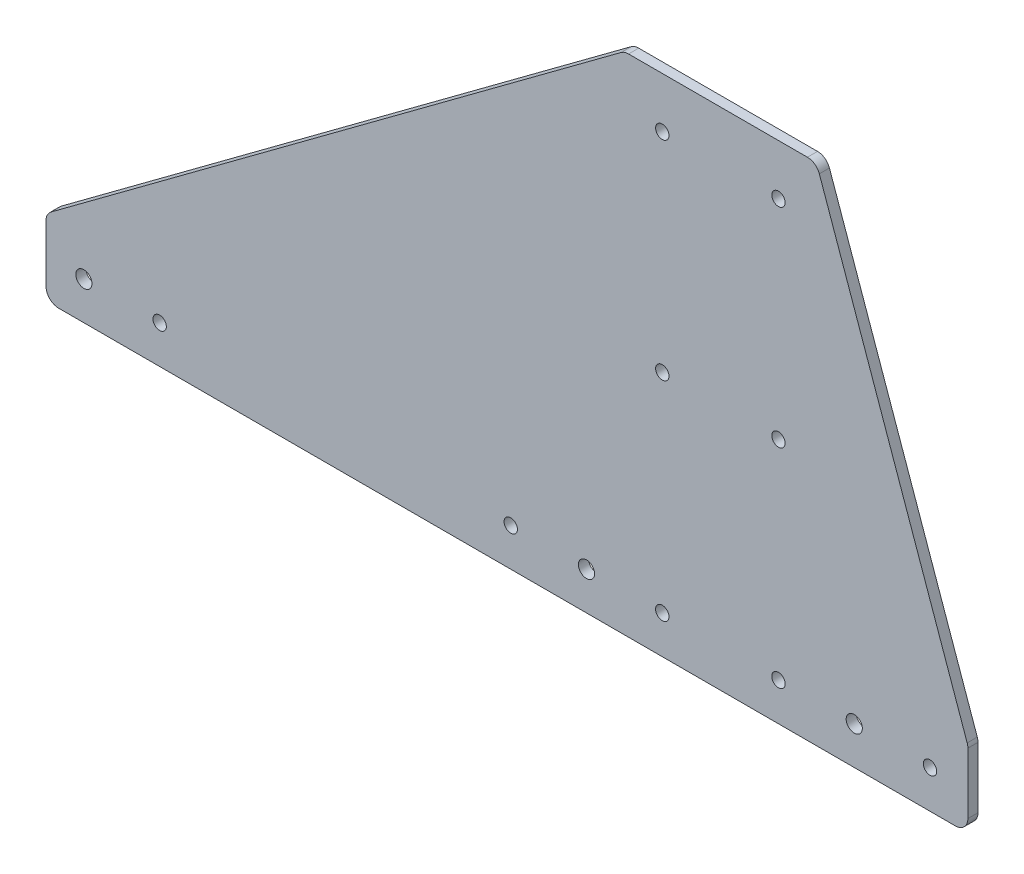
ISO-10303-21;
HEADER;
FILE_DESCRIPTION(('STEP AP214'),'2;1');
FILE_NAME('part.step','',(''),(''),'','','');
FILE_SCHEMA(('AUTOMOTIVE_DESIGN { 1 0 10303 214 1 1 1 1 }'));
ENDSEC;
DATA;
#1=APPLICATION_CONTEXT('core data for automotive mechanical design processes');
#2=APPLICATION_PROTOCOL_DEFINITION('international standard','automotive_design',2000,#1);
#3=PRODUCT_CONTEXT('',#1,'mechanical');
#4=PRODUCT('Part','Part','',(#3));
#5=PRODUCT_RELATED_PRODUCT_CATEGORY('part','',(#4));
#6=PRODUCT_DEFINITION_FORMATION('','',#4);
#7=PRODUCT_DEFINITION_CONTEXT('part definition',#1,'design');
#8=PRODUCT_DEFINITION('design','',#6,#7);
#9=PRODUCT_DEFINITION_SHAPE('','',#8);
#10=(LENGTH_UNIT() NAMED_UNIT(*) SI_UNIT(.MILLI.,.METRE.));
#11=(NAMED_UNIT(*) PLANE_ANGLE_UNIT() SI_UNIT($,.RADIAN.));
#12=(NAMED_UNIT(*) SI_UNIT($,.STERADIAN.) SOLID_ANGLE_UNIT());
#13=UNCERTAINTY_MEASURE_WITH_UNIT(LENGTH_MEASURE(1.E-05),#10,'distance_accuracy_value','');
#14=(GEOMETRIC_REPRESENTATION_CONTEXT(3) GLOBAL_UNCERTAINTY_ASSIGNED_CONTEXT((#13)) GLOBAL_UNIT_ASSIGNED_CONTEXT((#10,
#11,#12)) REPRESENTATION_CONTEXT('',''));
#15=CARTESIAN_POINT('',(0.,0.,0.));
#16=DIRECTION('',(0.,0.,1.));
#17=DIRECTION('',(1.,0.,0.));
#18=AXIS2_PLACEMENT_3D('',#15,#16,#17);
#19=CARTESIAN_POINT('',(-267.,0.,4.));
#20=DIRECTION('',(1.,0.,0.));
#21=DIRECTION('',(0.,0.,-1.));
#22=AXIS2_PLACEMENT_3D('',#19,#20,#21);
#23=PLANE('',#22);
#24=DIRECTION('',(0.,-1.,0.));
#25=VECTOR('',#24,1.);
#26=CARTESIAN_POINT('',(-267.,0.,0.));
#27=LINE('',#26,#25);
#28=CARTESIAN_POINT('',(-267.,-2.51535886821908,0.));
#29=VERTEX_POINT('',#28);
#30=CARTESIAN_POINT('',(-267.,-25.,0.));
#31=VERTEX_POINT('',#30);
#32=EDGE_CURVE('E202',#29,#31,#27,.T.);
#33=ORIENTED_EDGE('',*,*,#32,.T.);
#34=DIRECTION('',(0.,0.,-1.));
#35=VECTOR('',#34,1.);
#36=CARTESIAN_POINT('',(-267.,-25.,4.));
#37=LINE('',#36,#35);
#38=CARTESIAN_POINT('',(-267.,-25.,4.));
#39=VERTEX_POINT('',#38);
#40=EDGE_CURVE('E194',#31,#39,#37,.F.);
#41=ORIENTED_EDGE('',*,*,#40,.T.);
#42=DIRECTION('',(0.,-1.,0.));
#43=VECTOR('',#42,1.);
#44=CARTESIAN_POINT('',(-267.,0.,4.));
#45=LINE('',#44,#43);
#46=CARTESIAN_POINT('',(-267.,-2.51535886821908,4.));
#47=VERTEX_POINT('',#46);
#48=EDGE_CURVE('E151',#47,#39,#45,.T.);
#49=ORIENTED_EDGE('',*,*,#48,.F.);
#50=DIRECTION('',(0.,0.,-1.));
#51=VECTOR('',#50,1.);
#52=CARTESIAN_POINT('',(-267.,-2.51535886821908,4.));
#53=LINE('',#52,#51);
#54=EDGE_CURVE('E191',#47,#29,#53,.T.);
#55=ORIENTED_EDGE('',*,*,#54,.T.);
#56=EDGE_LOOP('',(#33,#41,#49,#55));
#57=FACE_BOUND('',#56,.T.);
#58=ADVANCED_FACE('F33',(#57),#23,.F.);
#59=CARTESIAN_POINT('',(-267.,-30.,4.));
#60=DIRECTION('',(0.,1.,0.));
#61=DIRECTION('',(0.,0.,1.));
#62=AXIS2_PLACEMENT_3D('',#59,#60,#61);
#63=PLANE('',#62);
#64=DIRECTION('',(1.,0.,0.));
#65=VECTOR('',#64,1.);
#66=CARTESIAN_POINT('',(-267.,-30.,0.));
#67=LINE('',#66,#65);
#68=CARTESIAN_POINT('',(-262.,-30.,0.));
#69=VERTEX_POINT('',#68);
#70=CARTESIAN_POINT('',(92.9999999999999,-30.,0.));
#71=VERTEX_POINT('',#70);
#72=EDGE_CURVE('E229',#69,#71,#67,.T.);
#73=ORIENTED_EDGE('',*,*,#72,.T.);
#74=DIRECTION('',(0.,0.,-1.));
#75=VECTOR('',#74,1.);
#76=CARTESIAN_POINT('',(93.,-30.,4.));
#77=LINE('',#76,#75);
#78=CARTESIAN_POINT('',(92.9999999999999,-30.,4.));
#79=VERTEX_POINT('',#78);
#80=EDGE_CURVE('E189',#71,#79,#77,.F.);
#81=ORIENTED_EDGE('',*,*,#80,.T.);
#82=DIRECTION('',(1.,0.,0.));
#83=VECTOR('',#82,1.);
#84=CARTESIAN_POINT('',(-267.,-30.,4.));
#85=LINE('',#84,#83);
#86=CARTESIAN_POINT('',(-262.,-30.,4.));
#87=VERTEX_POINT('',#86);
#88=EDGE_CURVE('E212',#87,#79,#85,.T.);
#89=ORIENTED_EDGE('',*,*,#88,.F.);
#90=DIRECTION('',(0.,0.,-1.));
#91=VECTOR('',#90,1.);
#92=CARTESIAN_POINT('',(-262.,-30.,4.));
#93=LINE('',#92,#91);
#94=EDGE_CURVE('E186',#87,#69,#93,.T.);
#95=ORIENTED_EDGE('',*,*,#94,.T.);
#96=EDGE_LOOP('',(#73,#81,#89,#95));
#97=FACE_BOUND('',#96,.T.);
#98=ADVANCED_FACE('F253',(#97),#63,.F.);
#99=CARTESIAN_POINT('',(98.,-30.,4.));
#100=DIRECTION('',(-1.,0.,0.));
#101=DIRECTION('',(0.,0.,1.));
#102=AXIS2_PLACEMENT_3D('',#99,#100,#101);
#103=PLANE('',#102);
#104=DIRECTION('',(0.,1.,0.));
#105=VECTOR('',#104,1.);
#106=CARTESIAN_POINT('',(98.,-30.,0.));
#107=LINE('',#106,#105);
#108=CARTESIAN_POINT('',(98.,-25.,0.));
#109=VERTEX_POINT('',#108);
#110=CARTESIAN_POINT('',(98.,-0.856463647766592,0.));
#111=VERTEX_POINT('',#110);
#112=EDGE_CURVE('E153',#109,#111,#107,.T.);
#113=ORIENTED_EDGE('',*,*,#112,.T.);
#114=DIRECTION('',(0.,0.,-1.));
#115=VECTOR('',#114,1.);
#116=CARTESIAN_POINT('',(98.,-0.856463647766592,4.));
#117=LINE('',#116,#115);
#118=CARTESIAN_POINT('',(98.,-0.856463647766592,4.));
#119=VERTEX_POINT('',#118);
#120=EDGE_CURVE('E184',#111,#119,#117,.F.);
#121=ORIENTED_EDGE('',*,*,#120,.T.);
#122=DIRECTION('',(0.,1.,0.));
#123=VECTOR('',#122,1.);
#124=CARTESIAN_POINT('',(98.,-30.,4.));
#125=LINE('',#124,#123);
#126=CARTESIAN_POINT('',(98.,-25.,4.));
#127=VERTEX_POINT('',#126);
#128=EDGE_CURVE('E215',#127,#119,#125,.T.);
#129=ORIENTED_EDGE('',*,*,#128,.F.);
#130=DIRECTION('',(0.,0.,-1.));
#131=VECTOR('',#130,1.);
#132=CARTESIAN_POINT('',(98.,-25.,4.));
#133=LINE('',#132,#131);
#134=EDGE_CURVE('E181',#127,#109,#133,.T.);
#135=ORIENTED_EDGE('',*,*,#134,.T.);
#136=EDGE_LOOP('',(#113,#121,#129,#135));
#137=FACE_BOUND('',#136,.T.);
#138=ADVANCED_FACE('F235',(#137),#103,.F.);
#139=CARTESIAN_POINT('',(98.,0.,4.));
#140=DIRECTION('',(-0.94299033358289,-0.332820117735137,0.));
#141=DIRECTION('',(0.332820117735137,-0.94299033358289,0.));
#142=AXIS2_PLACEMENT_3D('',#139,#140,#141);
#143=PLANE('',#142);
#144=DIRECTION('',(-0.332820117735137,0.94299033358289,0.));
#145=VECTOR('',#144,1.);
#146=CARTESIAN_POINT('',(98.,0.,0.));
#147=LINE('',#146,#145);
#148=CARTESIAN_POINT('',(97.7149516679144,0.807636940909095,0.));
#149=VERTEX_POINT('',#148);
#150=CARTESIAN_POINT('',(39.1773762628204,166.664100588676,0.));
#151=VERTEX_POINT('',#150);
#152=EDGE_CURVE('E149',#149,#151,#147,.T.);
#153=ORIENTED_EDGE('',*,*,#152,.T.);
#154=DIRECTION('',(0.,0.,-1.));
#155=VECTOR('',#154,1.);
#156=CARTESIAN_POINT('',(39.1773762628203,166.664100588676,4.));
#157=LINE('',#156,#155);
#158=CARTESIAN_POINT('',(39.1773762628204,166.664100588676,4.));
#159=VERTEX_POINT('',#158);
#160=EDGE_CURVE('E128',#151,#159,#157,.F.);
#161=ORIENTED_EDGE('',*,*,#160,.T.);
#162=DIRECTION('',(-0.332820117735137,0.94299033358289,0.));
#163=VECTOR('',#162,1.);
#164=CARTESIAN_POINT('',(98.,0.,4.));
#165=LINE('',#164,#163);
#166=CARTESIAN_POINT('',(97.7149516679144,0.807636940909095,4.));
#167=VERTEX_POINT('',#166);
#168=EDGE_CURVE('E223',#167,#159,#165,.T.);
#169=ORIENTED_EDGE('',*,*,#168,.F.);
#170=DIRECTION('',(0.,0.,-1.));
#171=VECTOR('',#170,1.);
#172=CARTESIAN_POINT('',(97.7149516679144,0.807636940909095,4.));
#173=LINE('',#172,#171);
#174=EDGE_CURVE('E133',#167,#149,#173,.T.);
#175=ORIENTED_EDGE('',*,*,#174,.T.);
#176=EDGE_LOOP('',(#153,#161,#169,#175));
#177=FACE_BOUND('',#176,.T.);
#178=ADVANCED_FACE('F245',(#177),#143,.F.);
#179=CARTESIAN_POINT('',(38.,170.,4.));
#180=DIRECTION('',(0.,-1.,0.));
#181=DIRECTION('',(0.,0.,-1.));
#182=AXIS2_PLACEMENT_3D('',#179,#180,#181);
#183=PLANE('',#182);
#184=DIRECTION('',(-1.,0.,0.));
#185=VECTOR('',#184,1.);
#186=CARTESIAN_POINT('',(38.,170.,4.));
#187=LINE('',#186,#185);
#188=CARTESIAN_POINT('',(34.4624245949059,170.,4.));
#189=VERTEX_POINT('',#188);
#190=CARTESIAN_POINT('',(-36.3469577598696,170.,4.));
#191=VERTEX_POINT('',#190);
#192=EDGE_CURVE('E142',#189,#191,#187,.T.);
#193=ORIENTED_EDGE('',*,*,#192,.F.);
#194=DIRECTION('',(0.,0.,-1.));
#195=VECTOR('',#194,1.);
#196=CARTESIAN_POINT('',(34.4624245949059,170.,4.));
#197=LINE('',#196,#195);
#198=CARTESIAN_POINT('',(34.4624245949059,170.,0.));
#199=VERTEX_POINT('',#198);
#200=EDGE_CURVE('E127',#189,#199,#197,.T.);
#201=ORIENTED_EDGE('',*,*,#200,.T.);
#202=DIRECTION('',(-1.,0.,0.));
#203=VECTOR('',#202,1.);
#204=CARTESIAN_POINT('',(38.,170.,0.));
#205=LINE('',#204,#203);
#206=CARTESIAN_POINT('',(-36.3469577598696,170.,0.));
#207=VERTEX_POINT('',#206);
#208=EDGE_CURVE('E140',#199,#207,#205,.T.);
#209=ORIENTED_EDGE('',*,*,#208,.T.);
#210=DIRECTION('',(0.,0.,-1.));
#211=VECTOR('',#210,1.);
#212=CARTESIAN_POINT('',(-36.3469577598696,170.,4.));
#213=LINE('',#212,#211);
#214=EDGE_CURVE('E144',#207,#191,#213,.F.);
#215=ORIENTED_EDGE('',*,*,#214,.T.);
#216=EDGE_LOOP('',(#193,#201,#209,#215));
#217=FACE_BOUND('',#216,.T.);
#218=ADVANCED_FACE('F139',(#217),#183,.F.);
#219=CARTESIAN_POINT('',(-38.,170.,4.));
#220=DIRECTION('',(0.596065749719744,-0.802935627563655,0.));
#221=DIRECTION('',(0.802935627563655,0.596065749719744,0.));
#222=AXIS2_PLACEMENT_3D('',#219,#220,#221);
#223=PLANE('',#222);
#224=DIRECTION('',(-0.802935627563655,-0.596065749719744,0.));
#225=VECTOR('',#224,1.);
#226=CARTESIAN_POINT('',(-38.,170.,0.));
#227=LINE('',#226,#225);
#228=CARTESIAN_POINT('',(-39.3272865084683,169.014678137818,0.));
#229=VERTEX_POINT('',#228);
#230=CARTESIAN_POINT('',(-264.980328748599,1.49931926959923,0.));
#231=VERTEX_POINT('',#230);
#232=EDGE_CURVE('E148',#229,#231,#227,.T.);
#233=ORIENTED_EDGE('',*,*,#232,.T.);
#234=DIRECTION('',(0.,0.,-1.));
#235=VECTOR('',#234,1.);
#236=CARTESIAN_POINT('',(-264.980328748599,1.4993192695992,4.));
#237=LINE('',#236,#235);
#238=CARTESIAN_POINT('',(-264.980328748599,1.49931926959923,4.));
#239=VERTEX_POINT('',#238);
#240=EDGE_CURVE('E11',#231,#239,#237,.F.);
#241=ORIENTED_EDGE('',*,*,#240,.T.);
#242=DIRECTION('',(-0.802935627563655,-0.596065749719744,0.));
#243=VECTOR('',#242,1.);
#244=CARTESIAN_POINT('',(-38.,170.,4.));
#245=LINE('',#244,#243);
#246=CARTESIAN_POINT('',(-39.3272865084683,169.014678137818,4.));
#247=VERTEX_POINT('',#246);
#248=EDGE_CURVE('E157',#247,#239,#245,.T.);
#249=ORIENTED_EDGE('',*,*,#248,.F.);
#250=DIRECTION('',(0.,0.,-1.));
#251=VECTOR('',#250,1.);
#252=CARTESIAN_POINT('',(-39.3272865084683,169.014678137818,4.));
#253=LINE('',#252,#251);
#254=EDGE_CURVE('E42',#247,#229,#253,.T.);
#255=ORIENTED_EDGE('',*,*,#254,.T.);
#256=EDGE_LOOP('',(#233,#241,#249,#255));
#257=FACE_BOUND('',#256,.T.);
#258=ADVANCED_FACE('F198',(#257),#223,.F.);
#259=CARTESIAN_POINT('',(0.,0.,4.));
#260=DIRECTION('',(0.,0.,1.));
#261=DIRECTION('',(1.,0.,0.));
#262=AXIS2_PLACEMENT_3D('',#259,#260,#261);
#263=PLANE('',#262);
#264=CARTESIAN_POINT('',(-252.,-15.0000000000002,4.));
#265=DIRECTION('',(0.,0.,1.));
#266=DIRECTION('',(1.,0.,0.));
#267=AXIS2_PLACEMENT_3D('',#264,#265,#266);
#268=CIRCLE('',#267,3.20000000000001);
#269=CARTESIAN_POINT('',(-248.8,-15.0000000000002,4.));
#270=VERTEX_POINT('',#269);
#271=EDGE_CURVE('E435',#270,#270,#268,.T.);
#272=ORIENTED_EDGE('',*,*,#271,.F.);
#273=EDGE_LOOP('',(#272));
#274=FACE_BOUND('',#273,.T.);
#275=CARTESIAN_POINT('',(-53.,-15.0000000000003,4.));
#276=DIRECTION('',(0.,0.,1.));
#277=DIRECTION('',(1.,0.,0.));
#278=AXIS2_PLACEMENT_3D('',#275,#276,#277);
#279=CIRCLE('',#278,3.2);
#280=CARTESIAN_POINT('',(-49.8,-15.0000000000003,4.));
#281=VERTEX_POINT('',#280);
#282=EDGE_CURVE('E438',#281,#281,#279,.T.);
#283=ORIENTED_EDGE('',*,*,#282,.F.);
#284=EDGE_LOOP('',(#283));
#285=FACE_BOUND('',#284,.T.);
#286=CARTESIAN_POINT('',(52.9999999999987,-15.0000000000003,4.));
#287=DIRECTION('',(0.,0.,1.));
#288=DIRECTION('',(1.,0.,0.));
#289=AXIS2_PLACEMENT_3D('',#286,#287,#288);
#290=CIRCLE('',#289,3.2);
#291=CARTESIAN_POINT('',(56.1999999999987,-15.0000000000003,4.));
#292=VERTEX_POINT('',#291);
#293=EDGE_CURVE('E446',#292,#292,#290,.T.);
#294=ORIENTED_EDGE('',*,*,#293,.F.);
#295=EDGE_LOOP('',(#294));
#296=FACE_BOUND('',#295,.T.);
#297=CARTESIAN_POINT('',(-23.,150.,4.));
#298=DIRECTION('',(0.,0.,1.));
#299=DIRECTION('',(1.,0.,0.));
#300=AXIS2_PLACEMENT_3D('',#297,#298,#299);
#301=CIRCLE('',#300,2.65);
#302=CARTESIAN_POINT('',(-20.35,150.,4.));
#303=VERTEX_POINT('',#302);
#304=EDGE_CURVE('E451',#303,#303,#301,.T.);
#305=ORIENTED_EDGE('',*,*,#304,.F.);
#306=EDGE_LOOP('',(#305));
#307=FACE_BOUND('',#306,.T.);
#308=CARTESIAN_POINT('',(-23.,67.5,4.));
#309=DIRECTION('',(0.,0.,1.));
#310=DIRECTION('',(1.,0.,0.));
#311=AXIS2_PLACEMENT_3D('',#308,#309,#310);
#312=CIRCLE('',#311,2.65);
#313=CARTESIAN_POINT('',(-20.35,67.5,4.));
#314=VERTEX_POINT('',#313);
#315=EDGE_CURVE('E457',#314,#314,#312,.T.);
#316=ORIENTED_EDGE('',*,*,#315,.F.);
#317=EDGE_LOOP('',(#316));
#318=FACE_BOUND('',#317,.T.);
#319=CARTESIAN_POINT('',(-23.,-15.,4.));
#320=DIRECTION('',(0.,0.,1.));
#321=DIRECTION('',(1.,0.,0.));
#322=AXIS2_PLACEMENT_3D('',#319,#320,#321);
#323=CIRCLE('',#322,2.65);
#324=CARTESIAN_POINT('',(-20.35,-15.,4.));
#325=VERTEX_POINT('',#324);
#326=EDGE_CURVE('E463',#325,#325,#323,.T.);
#327=ORIENTED_EDGE('',*,*,#326,.F.);
#328=EDGE_LOOP('',(#327));
#329=FACE_BOUND('',#328,.T.);
#330=CARTESIAN_POINT('',(23.,-15.,4.));
#331=DIRECTION('',(0.,0.,1.));
#332=DIRECTION('',(1.,0.,0.));
#333=AXIS2_PLACEMENT_3D('',#330,#331,#332);
#334=CIRCLE('',#333,2.65);
#335=CARTESIAN_POINT('',(25.65,-15.,4.));
#336=VERTEX_POINT('',#335);
#337=EDGE_CURVE('E469',#336,#336,#334,.T.);
#338=ORIENTED_EDGE('',*,*,#337,.F.);
#339=EDGE_LOOP('',(#338));
#340=FACE_BOUND('',#339,.T.);
#341=CARTESIAN_POINT('',(23.,150.,4.));
#342=DIRECTION('',(0.,0.,1.));
#343=DIRECTION('',(1.,0.,0.));
#344=AXIS2_PLACEMENT_3D('',#341,#342,#343);
#345=CIRCLE('',#344,2.65);
#346=CARTESIAN_POINT('',(25.65,150.,4.));
#347=VERTEX_POINT('',#346);
#348=EDGE_CURVE('E475',#347,#347,#345,.T.);
#349=ORIENTED_EDGE('',*,*,#348,.F.);
#350=EDGE_LOOP('',(#349));
#351=FACE_BOUND('',#350,.T.);
#352=CARTESIAN_POINT('',(23.,67.5,4.));
#353=DIRECTION('',(0.,0.,1.));
#354=DIRECTION('',(1.,0.,0.));
#355=AXIS2_PLACEMENT_3D('',#352,#353,#354);
#356=CIRCLE('',#355,2.65);
#357=CARTESIAN_POINT('',(25.65,67.5,4.));
#358=VERTEX_POINT('',#357);
#359=EDGE_CURVE('E481',#358,#358,#356,.T.);
#360=ORIENTED_EDGE('',*,*,#359,.F.);
#361=EDGE_LOOP('',(#360));
#362=FACE_BOUND('',#361,.T.);
#363=CARTESIAN_POINT('',(-83.,-15.,4.));
#364=DIRECTION('',(0.,0.,1.));
#365=DIRECTION('',(1.,0.,0.));
#366=AXIS2_PLACEMENT_3D('',#363,#364,#365);
#367=CIRCLE('',#366,2.65);
#368=CARTESIAN_POINT('',(-80.35,-15.,4.));
#369=VERTEX_POINT('',#368);
#370=EDGE_CURVE('E487',#369,#369,#367,.T.);
#371=ORIENTED_EDGE('',*,*,#370,.F.);
#372=EDGE_LOOP('',(#371));
#373=FACE_BOUND('',#372,.T.);
#374=CARTESIAN_POINT('',(83.,-15.,4.));
#375=DIRECTION('',(0.,0.,1.));
#376=DIRECTION('',(1.,0.,0.));
#377=AXIS2_PLACEMENT_3D('',#374,#375,#376);
#378=CIRCLE('',#377,2.65);
#379=CARTESIAN_POINT('',(85.65,-15.,4.));
#380=VERTEX_POINT('',#379);
#381=EDGE_CURVE('E493',#380,#380,#378,.T.);
#382=ORIENTED_EDGE('',*,*,#381,.F.);
#383=EDGE_LOOP('',(#382));
#384=FACE_BOUND('',#383,.T.);
#385=CARTESIAN_POINT('',(-222.,-15.,4.));
#386=DIRECTION('',(0.,0.,1.));
#387=DIRECTION('',(1.,0.,0.));
#388=AXIS2_PLACEMENT_3D('',#385,#386,#387);
#389=CIRCLE('',#388,2.64999999999999);
#390=CARTESIAN_POINT('',(-219.35,-15.,4.));
#391=VERTEX_POINT('',#390);
#392=EDGE_CURVE('E498',#391,#391,#389,.T.);
#393=ORIENTED_EDGE('',*,*,#392,.F.);
#394=EDGE_LOOP('',(#393));
#395=FACE_BOUND('',#394,.T.);
#396=ORIENTED_EDGE('',*,*,#168,.T.);
#397=CARTESIAN_POINT('',(34.4624245949059,165.,4.));
#398=DIRECTION('',(0.,0.,1.));
#399=DIRECTION('',(1.,0.,0.));
#400=AXIS2_PLACEMENT_3D('',#397,#398,#399);
#401=CIRCLE('',#400,5.);
#402=EDGE_CURVE('E179',#159,#189,#401,.T.);
#403=ORIENTED_EDGE('',*,*,#402,.T.);
#404=ORIENTED_EDGE('',*,*,#192,.T.);
#405=CARTESIAN_POINT('',(-36.3469577598696,165.,4.));
#406=DIRECTION('',(0.,0.,1.));
#407=DIRECTION('',(1.,0.,0.));
#408=AXIS2_PLACEMENT_3D('',#405,#406,#407);
#409=CIRCLE('',#408,5.);
#410=EDGE_CURVE('E54',#191,#247,#409,.T.);
#411=ORIENTED_EDGE('',*,*,#410,.T.);
#412=ORIENTED_EDGE('',*,*,#248,.T.);
#413=CARTESIAN_POINT('',(-262.,-2.51535886821908,4.));
#414=DIRECTION('',(0.,0.,1.));
#415=DIRECTION('',(1.,0.,0.));
#416=AXIS2_PLACEMENT_3D('',#413,#414,#415);
#417=CIRCLE('',#416,5.);
#418=EDGE_CURVE('E171',#239,#47,#417,.T.);
#419=ORIENTED_EDGE('',*,*,#418,.T.);
#420=ORIENTED_EDGE('',*,*,#48,.T.);
#421=CARTESIAN_POINT('',(-262.,-25.,4.));
#422=DIRECTION('',(0.,0.,1.));
#423=DIRECTION('',(1.,0.,0.));
#424=AXIS2_PLACEMENT_3D('',#421,#422,#423);
#425=CIRCLE('',#424,5.);
#426=EDGE_CURVE('E173',#39,#87,#425,.T.);
#427=ORIENTED_EDGE('',*,*,#426,.T.);
#428=ORIENTED_EDGE('',*,*,#88,.T.);
#429=CARTESIAN_POINT('',(93.,-25.,4.));
#430=DIRECTION('',(0.,0.,1.));
#431=DIRECTION('',(1.,0.,0.));
#432=AXIS2_PLACEMENT_3D('',#429,#430,#431);
#433=CIRCLE('',#432,5.);
#434=EDGE_CURVE('E175',#79,#127,#433,.T.);
#435=ORIENTED_EDGE('',*,*,#434,.T.);
#436=ORIENTED_EDGE('',*,*,#128,.T.);
#437=CARTESIAN_POINT('',(93.,-0.856463647766591,4.));
#438=DIRECTION('',(0.,0.,1.));
#439=DIRECTION('',(1.,0.,0.));
#440=AXIS2_PLACEMENT_3D('',#437,#438,#439);
#441=CIRCLE('',#440,5.);
#442=EDGE_CURVE('E177',#119,#167,#441,.T.);
#443=ORIENTED_EDGE('',*,*,#442,.T.);
#444=EDGE_LOOP('',(#396,#403,#404,#411,#412,#419,#420,#427,#428,#435,#436,#443));
#445=FACE_BOUND('',#444,.T.);
#446=ADVANCED_FACE('F243',(#274,#285,#296,#307,#318,#329,#340,#351,#362,#373,#384,#395,#445),
#263,.T.);
#447=CARTESIAN_POINT('',(0.,0.,0.));
#448=DIRECTION('',(0.,0.,1.));
#449=DIRECTION('',(1.,0.,0.));
#450=AXIS2_PLACEMENT_3D('',#447,#448,#449);
#451=PLANE('',#450);
#452=CARTESIAN_POINT('',(-252.,-15.0000000000002,0.));
#453=DIRECTION('',(0.,0.,1.));
#454=DIRECTION('',(1.,0.,0.));
#455=AXIS2_PLACEMENT_3D('',#452,#453,#454);
#456=CIRCLE('',#455,3.20000000000001);
#457=CARTESIAN_POINT('',(-248.8,-15.0000000000002,0.));
#458=VERTEX_POINT('',#457);
#459=EDGE_CURVE('E37',#458,#458,#456,.T.);
#460=ORIENTED_EDGE('',*,*,#459,.T.);
#461=EDGE_LOOP('',(#460));
#462=FACE_BOUND('',#461,.T.);
#463=CARTESIAN_POINT('',(-53.,-15.0000000000003,0.));
#464=DIRECTION('',(0.,0.,1.));
#465=DIRECTION('',(1.,0.,0.));
#466=AXIS2_PLACEMENT_3D('',#463,#464,#465);
#467=CIRCLE('',#466,3.2);
#468=CARTESIAN_POINT('',(-49.8,-15.0000000000003,0.));
#469=VERTEX_POINT('',#468);
#470=EDGE_CURVE('E440',#469,#469,#467,.T.);
#471=ORIENTED_EDGE('',*,*,#470,.T.);
#472=EDGE_LOOP('',(#471));
#473=FACE_BOUND('',#472,.T.);
#474=CARTESIAN_POINT('',(52.9999999999987,-15.0000000000003,0.));
#475=DIRECTION('',(0.,0.,1.));
#476=DIRECTION('',(1.,0.,0.));
#477=AXIS2_PLACEMENT_3D('',#474,#475,#476);
#478=CIRCLE('',#477,3.2);
#479=CARTESIAN_POINT('',(56.1999999999987,-15.0000000000003,0.));
#480=VERTEX_POINT('',#479);
#481=EDGE_CURVE('E448',#480,#480,#478,.T.);
#482=ORIENTED_EDGE('',*,*,#481,.T.);
#483=EDGE_LOOP('',(#482));
#484=FACE_BOUND('',#483,.T.);
#485=CARTESIAN_POINT('',(-23.,150.,0.));
#486=DIRECTION('',(0.,0.,1.));
#487=DIRECTION('',(1.,0.,0.));
#488=AXIS2_PLACEMENT_3D('',#485,#486,#487);
#489=CIRCLE('',#488,2.65);
#490=CARTESIAN_POINT('',(-20.35,150.,0.));
#491=VERTEX_POINT('',#490);
#492=EDGE_CURVE('E454',#491,#491,#489,.T.);
#493=ORIENTED_EDGE('',*,*,#492,.T.);
#494=EDGE_LOOP('',(#493));
#495=FACE_BOUND('',#494,.T.);
#496=CARTESIAN_POINT('',(-23.,67.5,0.));
#497=DIRECTION('',(0.,0.,1.));
#498=DIRECTION('',(1.,0.,0.));
#499=AXIS2_PLACEMENT_3D('',#496,#497,#498);
#500=CIRCLE('',#499,2.65);
#501=CARTESIAN_POINT('',(-20.35,67.5,0.));
#502=VERTEX_POINT('',#501);
#503=EDGE_CURVE('E460',#502,#502,#500,.T.);
#504=ORIENTED_EDGE('',*,*,#503,.T.);
#505=EDGE_LOOP('',(#504));
#506=FACE_BOUND('',#505,.T.);
#507=CARTESIAN_POINT('',(-23.,-15.,0.));
#508=DIRECTION('',(0.,0.,1.));
#509=DIRECTION('',(1.,0.,0.));
#510=AXIS2_PLACEMENT_3D('',#507,#508,#509);
#511=CIRCLE('',#510,2.65);
#512=CARTESIAN_POINT('',(-20.35,-15.,0.));
#513=VERTEX_POINT('',#512);
#514=EDGE_CURVE('E466',#513,#513,#511,.T.);
#515=ORIENTED_EDGE('',*,*,#514,.T.);
#516=EDGE_LOOP('',(#515));
#517=FACE_BOUND('',#516,.T.);
#518=CARTESIAN_POINT('',(23.,-15.,0.));
#519=DIRECTION('',(0.,0.,1.));
#520=DIRECTION('',(1.,0.,0.));
#521=AXIS2_PLACEMENT_3D('',#518,#519,#520);
#522=CIRCLE('',#521,2.65);
#523=CARTESIAN_POINT('',(25.65,-15.,0.));
#524=VERTEX_POINT('',#523);
#525=EDGE_CURVE('E472',#524,#524,#522,.T.);
#526=ORIENTED_EDGE('',*,*,#525,.T.);
#527=EDGE_LOOP('',(#526));
#528=FACE_BOUND('',#527,.T.);
#529=CARTESIAN_POINT('',(23.,150.,0.));
#530=DIRECTION('',(0.,0.,1.));
#531=DIRECTION('',(1.,0.,0.));
#532=AXIS2_PLACEMENT_3D('',#529,#530,#531);
#533=CIRCLE('',#532,2.65);
#534=CARTESIAN_POINT('',(25.65,150.,0.));
#535=VERTEX_POINT('',#534);
#536=EDGE_CURVE('E478',#535,#535,#533,.T.);
#537=ORIENTED_EDGE('',*,*,#536,.T.);
#538=EDGE_LOOP('',(#537));
#539=FACE_BOUND('',#538,.T.);
#540=CARTESIAN_POINT('',(23.,67.5,0.));
#541=DIRECTION('',(0.,0.,1.));
#542=DIRECTION('',(1.,0.,0.));
#543=AXIS2_PLACEMENT_3D('',#540,#541,#542);
#544=CIRCLE('',#543,2.65);
#545=CARTESIAN_POINT('',(25.65,67.5,0.));
#546=VERTEX_POINT('',#545);
#547=EDGE_CURVE('E484',#546,#546,#544,.T.);
#548=ORIENTED_EDGE('',*,*,#547,.T.);
#549=EDGE_LOOP('',(#548));
#550=FACE_BOUND('',#549,.T.);
#551=CARTESIAN_POINT('',(-83.,-15.,0.));
#552=DIRECTION('',(0.,0.,1.));
#553=DIRECTION('',(1.,0.,0.));
#554=AXIS2_PLACEMENT_3D('',#551,#552,#553);
#555=CIRCLE('',#554,2.65);
#556=CARTESIAN_POINT('',(-80.35,-15.,0.));
#557=VERTEX_POINT('',#556);
#558=EDGE_CURVE('E490',#557,#557,#555,.T.);
#559=ORIENTED_EDGE('',*,*,#558,.T.);
#560=EDGE_LOOP('',(#559));
#561=FACE_BOUND('',#560,.T.);
#562=CARTESIAN_POINT('',(83.,-15.,0.));
#563=DIRECTION('',(0.,0.,1.));
#564=DIRECTION('',(1.,0.,0.));
#565=AXIS2_PLACEMENT_3D('',#562,#563,#564);
#566=CIRCLE('',#565,2.65);
#567=CARTESIAN_POINT('',(85.65,-15.,0.));
#568=VERTEX_POINT('',#567);
#569=EDGE_CURVE('E496',#568,#568,#566,.T.);
#570=ORIENTED_EDGE('',*,*,#569,.T.);
#571=EDGE_LOOP('',(#570));
#572=FACE_BOUND('',#571,.T.);
#573=CARTESIAN_POINT('',(-222.,-15.,0.));
#574=DIRECTION('',(0.,0.,1.));
#575=DIRECTION('',(1.,0.,0.));
#576=AXIS2_PLACEMENT_3D('',#573,#574,#575);
#577=CIRCLE('',#576,2.64999999999999);
#578=CARTESIAN_POINT('',(-219.35,-15.,0.));
#579=VERTEX_POINT('',#578);
#580=EDGE_CURVE('E218',#579,#579,#577,.T.);
#581=ORIENTED_EDGE('',*,*,#580,.T.);
#582=EDGE_LOOP('',(#581));
#583=FACE_BOUND('',#582,.T.);
#584=ORIENTED_EDGE('',*,*,#208,.F.);
#585=CARTESIAN_POINT('',(34.4624245949059,165.,0.));
#586=DIRECTION('',(0.,0.,1.));
#587=DIRECTION('',(1.,0.,0.));
#588=AXIS2_PLACEMENT_3D('',#585,#586,#587);
#589=CIRCLE('',#588,5.);
#590=EDGE_CURVE('E123',#199,#151,#589,.F.);
#591=ORIENTED_EDGE('',*,*,#590,.T.);
#592=ORIENTED_EDGE('',*,*,#152,.F.);
#593=CARTESIAN_POINT('',(93.,-0.856463647766591,0.));
#594=DIRECTION('',(0.,0.,1.));
#595=DIRECTION('',(1.,0.,0.));
#596=AXIS2_PLACEMENT_3D('',#593,#594,#595);
#597=CIRCLE('',#596,5.);
#598=EDGE_CURVE('E134',#149,#111,#597,.F.);
#599=ORIENTED_EDGE('',*,*,#598,.T.);
#600=ORIENTED_EDGE('',*,*,#112,.F.);
#601=CARTESIAN_POINT('',(93.,-25.,0.));
#602=DIRECTION('',(0.,0.,1.));
#603=DIRECTION('',(1.,0.,0.));
#604=AXIS2_PLACEMENT_3D('',#601,#602,#603);
#605=CIRCLE('',#604,5.);
#606=EDGE_CURVE('E164',#109,#71,#605,.F.);
#607=ORIENTED_EDGE('',*,*,#606,.T.);
#608=ORIENTED_EDGE('',*,*,#72,.F.);
#609=CARTESIAN_POINT('',(-262.,-25.,0.));
#610=DIRECTION('',(0.,0.,1.));
#611=DIRECTION('',(1.,0.,0.));
#612=AXIS2_PLACEMENT_3D('',#609,#610,#611);
#613=CIRCLE('',#612,5.);
#614=EDGE_CURVE('E162',#69,#31,#613,.F.);
#615=ORIENTED_EDGE('',*,*,#614,.T.);
#616=ORIENTED_EDGE('',*,*,#32,.F.);
#617=CARTESIAN_POINT('',(-262.,-2.51535886821908,0.));
#618=DIRECTION('',(0.,0.,1.));
#619=DIRECTION('',(1.,0.,0.));
#620=AXIS2_PLACEMENT_3D('',#617,#618,#619);
#621=CIRCLE('',#620,5.);
#622=EDGE_CURVE('E160',#29,#231,#621,.F.);
#623=ORIENTED_EDGE('',*,*,#622,.T.);
#624=ORIENTED_EDGE('',*,*,#232,.F.);
#625=CARTESIAN_POINT('',(-36.3469577598696,165.,0.));
#626=DIRECTION('',(0.,0.,1.));
#627=DIRECTION('',(1.,0.,0.));
#628=AXIS2_PLACEMENT_3D('',#625,#626,#627);
#629=CIRCLE('',#628,5.);
#630=EDGE_CURVE('E143',#229,#207,#629,.F.);
#631=ORIENTED_EDGE('',*,*,#630,.T.);
#632=EDGE_LOOP('',(#584,#591,#592,#599,#600,#607,#608,#615,#616,#623,#624,#631));
#633=FACE_BOUND('',#632,.T.);
#634=ADVANCED_FACE('F146',(#462,#473,#484,#495,#506,#517,#528,#539,#550,#561,#572,#583,#633),
#451,.F.);
#635=CARTESIAN_POINT('',(-222.,-15.,4.));
#636=DIRECTION('',(0.,0.,1.));
#637=DIRECTION('',(1.,0.,0.));
#638=AXIS2_PLACEMENT_3D('',#635,#636,#637);
#639=CYLINDRICAL_SURFACE('',#638,2.64999999999999);
#640=ORIENTED_EDGE('',*,*,#580,.F.);
#641=EDGE_LOOP('',(#640));
#642=FACE_BOUND('',#641,.T.);
#643=ORIENTED_EDGE('',*,*,#392,.T.);
#644=EDGE_LOOP('',(#643));
#645=FACE_BOUND('',#644,.T.);
#646=ADVANCED_FACE('F326',(#642,#645),#639,.F.);
#647=CARTESIAN_POINT('',(83.,-15.,4.));
#648=DIRECTION('',(0.,0.,1.));
#649=DIRECTION('',(1.,0.,0.));
#650=AXIS2_PLACEMENT_3D('',#647,#648,#649);
#651=CYLINDRICAL_SURFACE('',#650,2.65);
#652=ORIENTED_EDGE('',*,*,#569,.F.);
#653=EDGE_LOOP('',(#652));
#654=FACE_BOUND('',#653,.T.);
#655=ORIENTED_EDGE('',*,*,#381,.T.);
#656=EDGE_LOOP('',(#655));
#657=FACE_BOUND('',#656,.T.);
#658=ADVANCED_FACE('F322',(#654,#657),#651,.F.);
#659=CARTESIAN_POINT('',(-83.,-15.,4.));
#660=DIRECTION('',(0.,0.,1.));
#661=DIRECTION('',(1.,0.,0.));
#662=AXIS2_PLACEMENT_3D('',#659,#660,#661);
#663=CYLINDRICAL_SURFACE('',#662,2.65);
#664=ORIENTED_EDGE('',*,*,#558,.F.);
#665=EDGE_LOOP('',(#664));
#666=FACE_BOUND('',#665,.T.);
#667=ORIENTED_EDGE('',*,*,#370,.T.);
#668=EDGE_LOOP('',(#667));
#669=FACE_BOUND('',#668,.T.);
#670=ADVANCED_FACE('F318',(#666,#669),#663,.F.);
#671=CARTESIAN_POINT('',(23.,67.5,4.));
#672=DIRECTION('',(0.,0.,1.));
#673=DIRECTION('',(1.,0.,0.));
#674=AXIS2_PLACEMENT_3D('',#671,#672,#673);
#675=CYLINDRICAL_SURFACE('',#674,2.65);
#676=ORIENTED_EDGE('',*,*,#547,.F.);
#677=EDGE_LOOP('',(#676));
#678=FACE_BOUND('',#677,.T.);
#679=ORIENTED_EDGE('',*,*,#359,.T.);
#680=EDGE_LOOP('',(#679));
#681=FACE_BOUND('',#680,.T.);
#682=ADVANCED_FACE('F314',(#678,#681),#675,.F.);
#683=CARTESIAN_POINT('',(23.,150.,4.));
#684=DIRECTION('',(0.,0.,1.));
#685=DIRECTION('',(1.,0.,0.));
#686=AXIS2_PLACEMENT_3D('',#683,#684,#685);
#687=CYLINDRICAL_SURFACE('',#686,2.65);
#688=ORIENTED_EDGE('',*,*,#536,.F.);
#689=EDGE_LOOP('',(#688));
#690=FACE_BOUND('',#689,.T.);
#691=ORIENTED_EDGE('',*,*,#348,.T.);
#692=EDGE_LOOP('',(#691));
#693=FACE_BOUND('',#692,.T.);
#694=ADVANCED_FACE('F310',(#690,#693),#687,.F.);
#695=CARTESIAN_POINT('',(23.,-15.,4.));
#696=DIRECTION('',(0.,0.,1.));
#697=DIRECTION('',(1.,0.,0.));
#698=AXIS2_PLACEMENT_3D('',#695,#696,#697);
#699=CYLINDRICAL_SURFACE('',#698,2.65);
#700=ORIENTED_EDGE('',*,*,#525,.F.);
#701=EDGE_LOOP('',(#700));
#702=FACE_BOUND('',#701,.T.);
#703=ORIENTED_EDGE('',*,*,#337,.T.);
#704=EDGE_LOOP('',(#703));
#705=FACE_BOUND('',#704,.T.);
#706=ADVANCED_FACE('F306',(#702,#705),#699,.F.);
#707=CARTESIAN_POINT('',(-23.,-15.,4.));
#708=DIRECTION('',(0.,0.,1.));
#709=DIRECTION('',(1.,0.,0.));
#710=AXIS2_PLACEMENT_3D('',#707,#708,#709);
#711=CYLINDRICAL_SURFACE('',#710,2.65);
#712=ORIENTED_EDGE('',*,*,#514,.F.);
#713=EDGE_LOOP('',(#712));
#714=FACE_BOUND('',#713,.T.);
#715=ORIENTED_EDGE('',*,*,#326,.T.);
#716=EDGE_LOOP('',(#715));
#717=FACE_BOUND('',#716,.T.);
#718=ADVANCED_FACE('F302',(#714,#717),#711,.F.);
#719=CARTESIAN_POINT('',(-23.,67.5,4.));
#720=DIRECTION('',(0.,0.,1.));
#721=DIRECTION('',(1.,0.,0.));
#722=AXIS2_PLACEMENT_3D('',#719,#720,#721);
#723=CYLINDRICAL_SURFACE('',#722,2.65);
#724=ORIENTED_EDGE('',*,*,#503,.F.);
#725=EDGE_LOOP('',(#724));
#726=FACE_BOUND('',#725,.T.);
#727=ORIENTED_EDGE('',*,*,#315,.T.);
#728=EDGE_LOOP('',(#727));
#729=FACE_BOUND('',#728,.T.);
#730=ADVANCED_FACE('F298',(#726,#729),#723,.F.);
#731=CARTESIAN_POINT('',(-23.,150.,4.));
#732=DIRECTION('',(0.,0.,1.));
#733=DIRECTION('',(1.,0.,0.));
#734=AXIS2_PLACEMENT_3D('',#731,#732,#733);
#735=CYLINDRICAL_SURFACE('',#734,2.65);
#736=ORIENTED_EDGE('',*,*,#492,.F.);
#737=EDGE_LOOP('',(#736));
#738=FACE_BOUND('',#737,.T.);
#739=ORIENTED_EDGE('',*,*,#304,.T.);
#740=EDGE_LOOP('',(#739));
#741=FACE_BOUND('',#740,.T.);
#742=ADVANCED_FACE('F265',(#738,#741),#735,.F.);
#743=CARTESIAN_POINT('',(34.4624245949059,165.,4.));
#744=DIRECTION('',(0.,0.,-1.));
#745=DIRECTION('',(-1.,0.,0.));
#746=AXIS2_PLACEMENT_3D('',#743,#744,#745);
#747=CYLINDRICAL_SURFACE('',#746,5.);
#748=ORIENTED_EDGE('',*,*,#402,.F.);
#749=ORIENTED_EDGE('',*,*,#160,.F.);
#750=ORIENTED_EDGE('',*,*,#590,.F.);
#751=ORIENTED_EDGE('',*,*,#200,.F.);
#752=EDGE_LOOP('',(#748,#749,#750,#751));
#753=FACE_BOUND('',#752,.T.);
#754=ADVANCED_FACE('F126',(#753),#747,.T.);
#755=CARTESIAN_POINT('',(93.,-0.856463647766591,4.));
#756=DIRECTION('',(0.,0.,-1.));
#757=DIRECTION('',(-1.,0.,0.));
#758=AXIS2_PLACEMENT_3D('',#755,#756,#757);
#759=CYLINDRICAL_SURFACE('',#758,5.);
#760=ORIENTED_EDGE('',*,*,#442,.F.);
#761=ORIENTED_EDGE('',*,*,#120,.F.);
#762=ORIENTED_EDGE('',*,*,#598,.F.);
#763=ORIENTED_EDGE('',*,*,#174,.F.);
#764=EDGE_LOOP('',(#760,#761,#762,#763));
#765=FACE_BOUND('',#764,.T.);
#766=ADVANCED_FACE('F240',(#765),#759,.T.);
#767=CARTESIAN_POINT('',(93.,-25.,4.));
#768=DIRECTION('',(0.,0.,-1.));
#769=DIRECTION('',(-1.,0.,0.));
#770=AXIS2_PLACEMENT_3D('',#767,#768,#769);
#771=CYLINDRICAL_SURFACE('',#770,5.);
#772=ORIENTED_EDGE('',*,*,#434,.F.);
#773=ORIENTED_EDGE('',*,*,#80,.F.);
#774=ORIENTED_EDGE('',*,*,#606,.F.);
#775=ORIENTED_EDGE('',*,*,#134,.F.);
#776=EDGE_LOOP('',(#772,#773,#774,#775));
#777=FACE_BOUND('',#776,.T.);
#778=ADVANCED_FACE('F268',(#777),#771,.T.);
#779=CARTESIAN_POINT('',(-262.,-25.,4.));
#780=DIRECTION('',(0.,0.,-1.));
#781=DIRECTION('',(-1.,0.,0.));
#782=AXIS2_PLACEMENT_3D('',#779,#780,#781);
#783=CYLINDRICAL_SURFACE('',#782,5.);
#784=ORIENTED_EDGE('',*,*,#426,.F.);
#785=ORIENTED_EDGE('',*,*,#40,.F.);
#786=ORIENTED_EDGE('',*,*,#614,.F.);
#787=ORIENTED_EDGE('',*,*,#94,.F.);
#788=EDGE_LOOP('',(#784,#785,#786,#787));
#789=FACE_BOUND('',#788,.T.);
#790=ADVANCED_FACE('F271',(#789),#783,.T.);
#791=CARTESIAN_POINT('',(-262.,-2.51535886821908,4.));
#792=DIRECTION('',(0.,0.,-1.));
#793=DIRECTION('',(-1.,0.,0.));
#794=AXIS2_PLACEMENT_3D('',#791,#792,#793);
#795=CYLINDRICAL_SURFACE('',#794,5.);
#796=ORIENTED_EDGE('',*,*,#418,.F.);
#797=ORIENTED_EDGE('',*,*,#240,.F.);
#798=ORIENTED_EDGE('',*,*,#622,.F.);
#799=ORIENTED_EDGE('',*,*,#54,.F.);
#800=EDGE_LOOP('',(#796,#797,#798,#799));
#801=FACE_BOUND('',#800,.T.);
#802=ADVANCED_FACE('F206',(#801),#795,.T.);
#803=CARTESIAN_POINT('',(-36.3469577598696,165.,4.));
#804=DIRECTION('',(0.,0.,-1.));
#805=DIRECTION('',(-1.,0.,0.));
#806=AXIS2_PLACEMENT_3D('',#803,#804,#805);
#807=CYLINDRICAL_SURFACE('',#806,5.);
#808=ORIENTED_EDGE('',*,*,#410,.F.);
#809=ORIENTED_EDGE('',*,*,#214,.F.);
#810=ORIENTED_EDGE('',*,*,#630,.F.);
#811=ORIENTED_EDGE('',*,*,#254,.F.);
#812=EDGE_LOOP('',(#808,#809,#810,#811));
#813=FACE_BOUND('',#812,.T.);
#814=ADVANCED_FACE('F35',(#813),#807,.T.);
#815=CARTESIAN_POINT('',(52.9999999999987,-15.0000000000003,4.));
#816=DIRECTION('',(0.,0.,1.));
#817=DIRECTION('',(1.,0.,0.));
#818=AXIS2_PLACEMENT_3D('',#815,#816,#817);
#819=CYLINDRICAL_SURFACE('',#818,3.2);
#820=ORIENTED_EDGE('',*,*,#293,.T.);
#821=EDGE_LOOP('',(#820));
#822=FACE_BOUND('',#821,.T.);
#823=ORIENTED_EDGE('',*,*,#481,.F.);
#824=EDGE_LOOP('',(#823));
#825=FACE_BOUND('',#824,.T.);
#826=ADVANCED_FACE('F279',(#822,#825),#819,.F.);
#827=CARTESIAN_POINT('',(-53.,-15.0000000000003,4.));
#828=DIRECTION('',(0.,0.,1.));
#829=DIRECTION('',(1.,0.,0.));
#830=AXIS2_PLACEMENT_3D('',#827,#828,#829);
#831=CYLINDRICAL_SURFACE('',#830,3.2);
#832=ORIENTED_EDGE('',*,*,#282,.T.);
#833=EDGE_LOOP('',(#832));
#834=FACE_BOUND('',#833,.T.);
#835=ORIENTED_EDGE('',*,*,#470,.F.);
#836=EDGE_LOOP('',(#835));
#837=FACE_BOUND('',#836,.T.);
#838=ADVANCED_FACE('F283',(#834,#837),#831,.F.);
#839=CARTESIAN_POINT('',(-252.,-15.0000000000002,4.));
#840=DIRECTION('',(0.,0.,1.));
#841=DIRECTION('',(1.,0.,0.));
#842=AXIS2_PLACEMENT_3D('',#839,#840,#841);
#843=CYLINDRICAL_SURFACE('',#842,3.20000000000001);
#844=ORIENTED_EDGE('',*,*,#271,.T.);
#845=EDGE_LOOP('',(#844));
#846=FACE_BOUND('',#845,.T.);
#847=ORIENTED_EDGE('',*,*,#459,.F.);
#848=EDGE_LOOP('',(#847));
#849=FACE_BOUND('',#848,.T.);
#850=ADVANCED_FACE('F289',(#846,#849),#843,.F.);
#851=CLOSED_SHELL('',(#58,#98,#138,#178,#218,#258,#446,#634,#646,#658,#670,#682,#694,#706,#718,
#730,#742,#754,#766,#778,#790,#802,#814,#826,#838,#850));
#852=MANIFOLD_SOLID_BREP('B2',#851);
#853=ADVANCED_BREP_SHAPE_REPRESENTATION('',(#18,#852),#14);
#854=SHAPE_DEFINITION_REPRESENTATION(#9,#853);
ENDSEC;
END-ISO-10303-21;
